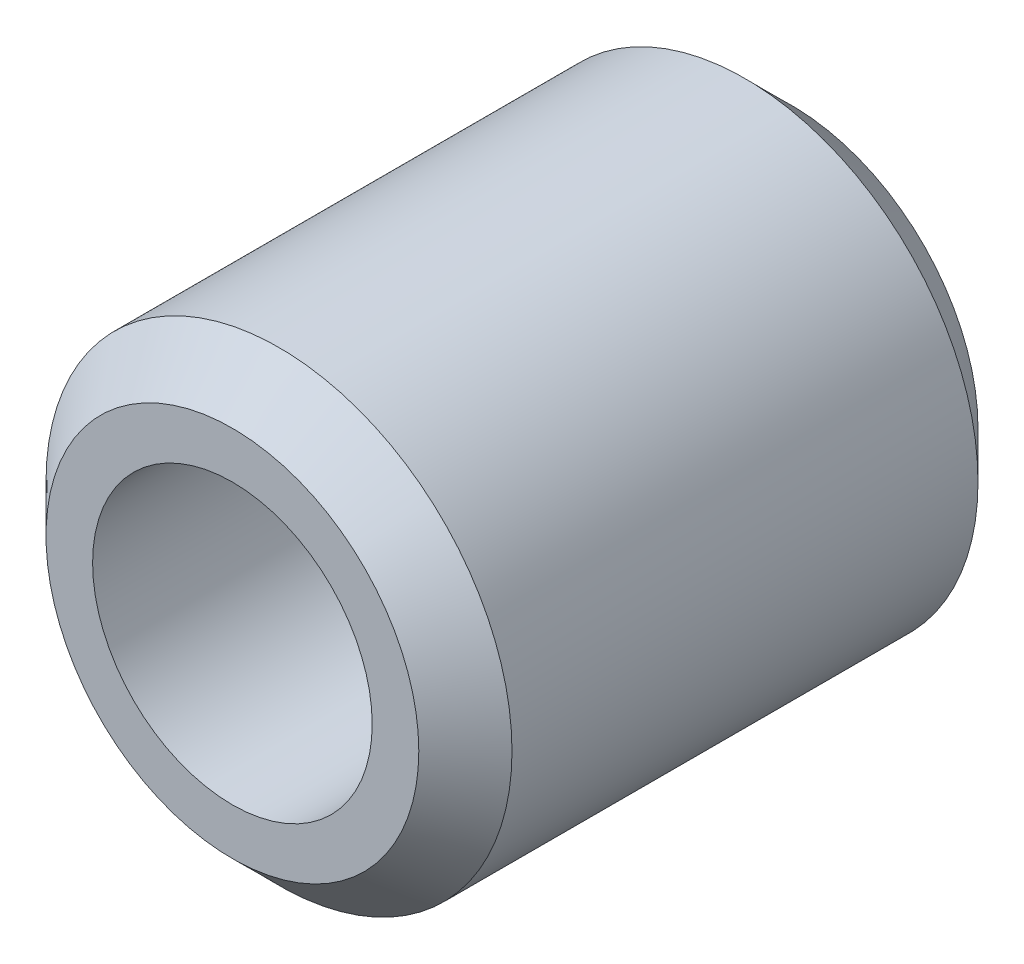
ISO-10303-21;
HEADER;
FILE_DESCRIPTION(('STEP AP214'),'2;1');
FILE_NAME('part.step','',(''),(''),'','','');
FILE_SCHEMA(('AUTOMOTIVE_DESIGN { 1 0 10303 214 1 1 1 1 }'));
ENDSEC;
DATA;
#1=APPLICATION_CONTEXT('core data for automotive mechanical design processes');
#2=APPLICATION_PROTOCOL_DEFINITION('international standard','automotive_design',2000,#1);
#3=PRODUCT_CONTEXT('',#1,'mechanical');
#4=PRODUCT('Part','Part','',(#3));
#5=PRODUCT_RELATED_PRODUCT_CATEGORY('part','',(#4));
#6=PRODUCT_DEFINITION_FORMATION('','',#4);
#7=PRODUCT_DEFINITION_CONTEXT('part definition',#1,'design');
#8=PRODUCT_DEFINITION('design','',#6,#7);
#9=PRODUCT_DEFINITION_SHAPE('','',#8);
#10=(LENGTH_UNIT() NAMED_UNIT(*) SI_UNIT(.MILLI.,.METRE.));
#11=(NAMED_UNIT(*) PLANE_ANGLE_UNIT() SI_UNIT($,.RADIAN.));
#12=(NAMED_UNIT(*) SI_UNIT($,.STERADIAN.) SOLID_ANGLE_UNIT());
#13=UNCERTAINTY_MEASURE_WITH_UNIT(LENGTH_MEASURE(1.E-05),#10,'distance_accuracy_value','');
#14=(GEOMETRIC_REPRESENTATION_CONTEXT(3) GLOBAL_UNCERTAINTY_ASSIGNED_CONTEXT((#13)) GLOBAL_UNIT_ASSIGNED_CONTEXT((#10,
#11,#12)) REPRESENTATION_CONTEXT('',''));
#15=CARTESIAN_POINT('',(0.,0.,0.));
#16=DIRECTION('',(0.,0.,1.));
#17=DIRECTION('',(1.,0.,0.));
#18=AXIS2_PLACEMENT_3D('',#15,#16,#17);
#19=CARTESIAN_POINT('',(0.,0.,-19.05));
#20=DIRECTION('',(0.,0.,1.));
#21=DIRECTION('',(1.,0.,0.));
#22=AXIS2_PLACEMENT_3D('',#19,#20,#21);
#23=PLANE('',#22);
#24=CARTESIAN_POINT('',(0.,0.,-19.05));
#25=DIRECTION('',(0.,0.,1.));
#26=DIRECTION('',(1.,0.,0.));
#27=AXIS2_PLACEMENT_3D('',#24,#25,#26);
#28=CIRCLE('',#27,6.34999999999998);
#29=CARTESIAN_POINT('',(6.34999999999998,0.,-19.05));
#30=VERTEX_POINT('',#29);
#31=EDGE_CURVE('E41',#30,#30,#28,.F.);
#32=ORIENTED_EDGE('',*,*,#31,.T.);
#33=EDGE_LOOP('',(#32));
#34=FACE_BOUND('',#33,.T.);
#35=ADVANCED_FACE('F34',(#34),#23,.F.);
#36=CARTESIAN_POINT('',(0.,0.,-19.05));
#37=DIRECTION('',(0.,0.,1.));
#38=DIRECTION('',(1.,0.,0.));
#39=AXIS2_PLACEMENT_3D('',#36,#37,#38);
#40=CYLINDRICAL_SURFACE('',#39,7.9375);
#41=CARTESIAN_POINT('',(0.,0.,-17.4625));
#42=DIRECTION('',(0.,0.,1.));
#43=DIRECTION('',(1.,0.,0.));
#44=AXIS2_PLACEMENT_3D('',#41,#42,#43);
#45=CIRCLE('',#44,7.9375);
#46=CARTESIAN_POINT('',(7.9375,0.,-17.4625));
#47=VERTEX_POINT('',#46);
#48=EDGE_CURVE('E45',#47,#47,#45,.T.);
#49=CARTESIAN_POINT('',(0.,0.,-1.58749999999999));
#50=DIRECTION('',(0.,0.,1.));
#51=DIRECTION('',(1.,0.,0.));
#52=AXIS2_PLACEMENT_3D('',#49,#50,#51);
#53=CIRCLE('',#52,7.9375);
#54=CARTESIAN_POINT('',(7.9375,0.,-1.58749999999999));
#55=VERTEX_POINT('',#54);
#56=EDGE_CURVE('E49',#55,#55,#53,.F.);
#57=CARTESIAN_POINT('',(7.9375,0.,-17.4625));
#58=CARTESIAN_POINT('',(7.9375,0.,-17.2971354166667));
#59=CARTESIAN_POINT('',(7.9375,0.,-17.1317708333333));
#60=CARTESIAN_POINT('',(7.9375,0.,-16.8010416666667));
#61=CARTESIAN_POINT('',(7.9375,0.,-16.6356770833333));
#62=CARTESIAN_POINT('',(7.9375,0.,-16.3049479166667));
#63=CARTESIAN_POINT('',(7.9375,0.,-16.1395833333333));
#64=CARTESIAN_POINT('',(7.9375,0.,-15.8088541666667));
#65=CARTESIAN_POINT('',(7.9375,0.,-15.6434895833333));
#66=CARTESIAN_POINT('',(7.9375,0.,-15.3127604166667));
#67=CARTESIAN_POINT('',(7.9375,0.,-15.1473958333333));
#68=CARTESIAN_POINT('',(7.9375,0.,-14.8166666666667));
#69=CARTESIAN_POINT('',(7.9375,0.,-14.6513020833333));
#70=CARTESIAN_POINT('',(7.9375,0.,-14.3205729166667));
#71=CARTESIAN_POINT('',(7.9375,0.,-14.1552083333333));
#72=CARTESIAN_POINT('',(7.9375,0.,-13.8244791666667));
#73=CARTESIAN_POINT('',(7.9375,0.,-13.6591145833333));
#74=CARTESIAN_POINT('',(7.9375,0.,-13.3283854166667));
#75=CARTESIAN_POINT('',(7.9375,0.,-13.1630208333333));
#76=CARTESIAN_POINT('',(7.9375,0.,-12.8322916666667));
#77=CARTESIAN_POINT('',(7.9375,0.,-12.6669270833333));
#78=CARTESIAN_POINT('',(7.9375,0.,-12.3361979166667));
#79=CARTESIAN_POINT('',(7.9375,0.,-12.1708333333333));
#80=CARTESIAN_POINT('',(7.9375,0.,-11.8401041666667));
#81=CARTESIAN_POINT('',(7.9375,0.,-11.6747395833333));
#82=CARTESIAN_POINT('',(7.9375,0.,-11.3440104166667));
#83=CARTESIAN_POINT('',(7.9375,0.,-11.1786458333333));
#84=CARTESIAN_POINT('',(7.9375,0.,-10.8479166666667));
#85=CARTESIAN_POINT('',(7.9375,0.,-10.6825520833333));
#86=CARTESIAN_POINT('',(7.9375,0.,-10.3518229166667));
#87=CARTESIAN_POINT('',(7.9375,0.,-10.1864583333333));
#88=CARTESIAN_POINT('',(7.9375,0.,-9.85572916666666));
#89=CARTESIAN_POINT('',(7.9375,0.,-9.69036458333332));
#90=CARTESIAN_POINT('',(7.9375,0.,-9.35963541666666));
#91=CARTESIAN_POINT('',(7.9375,0.,-9.19427083333333));
#92=CARTESIAN_POINT('',(7.9375,0.,-8.86354166666666));
#93=CARTESIAN_POINT('',(7.9375,0.,-8.69817708333333));
#94=CARTESIAN_POINT('',(7.9375,0.,-8.36744791666666));
#95=CARTESIAN_POINT('',(7.9375,0.,-8.20208333333333));
#96=CARTESIAN_POINT('',(7.9375,0.,-7.87135416666666));
#97=CARTESIAN_POINT('',(7.9375,0.,-7.70598958333333));
#98=CARTESIAN_POINT('',(7.9375,0.,-7.37526041666666));
#99=CARTESIAN_POINT('',(7.9375,0.,-7.20989583333333));
#100=CARTESIAN_POINT('',(7.9375,0.,-6.87916666666666));
#101=CARTESIAN_POINT('',(7.9375,0.,-6.71380208333333));
#102=CARTESIAN_POINT('',(7.9375,0.,-6.38307291666666));
#103=CARTESIAN_POINT('',(7.9375,0.,-6.21770833333332));
#104=CARTESIAN_POINT('',(7.9375,0.,-5.88697916666666));
#105=CARTESIAN_POINT('',(7.9375,0.,-5.72161458333333));
#106=CARTESIAN_POINT('',(7.9375,0.,-5.39088541666666));
#107=CARTESIAN_POINT('',(7.9375,0.,-5.22552083333333));
#108=CARTESIAN_POINT('',(7.9375,0.,-4.89479166666666));
#109=CARTESIAN_POINT('',(7.9375,0.,-4.72942708333333));
#110=CARTESIAN_POINT('',(7.9375,0.,-4.39869791666666));
#111=CARTESIAN_POINT('',(7.9375,0.,-4.23333333333332));
#112=CARTESIAN_POINT('',(7.9375,0.,-3.90260416666666));
#113=CARTESIAN_POINT('',(7.9375,0.,-3.73723958333332));
#114=CARTESIAN_POINT('',(7.9375,0.,-3.40651041666666));
#115=CARTESIAN_POINT('',(7.9375,0.,-3.24114583333333));
#116=CARTESIAN_POINT('',(7.9375,0.,-2.91041666666666));
#117=CARTESIAN_POINT('',(7.9375,0.,-2.74505208333333));
#118=CARTESIAN_POINT('',(7.9375,0.,-2.41432291666666));
#119=CARTESIAN_POINT('',(7.9375,0.,-2.24895833333332));
#120=CARTESIAN_POINT('',(7.9375,0.,-1.91822916666666));
#121=CARTESIAN_POINT('',(7.9375,0.,-1.75286458333332));
#122=CARTESIAN_POINT('',(7.9375,0.,-1.58749999999999));
#123=B_SPLINE_CURVE_WITH_KNOTS('',3,(#57,#58,#59,#60,#61,#62,#63,#64,#65,#66,#67,#68,#69,#70,
#71,#72,#73,#74,#75,#76,#77,#78,#79,#80,#81,#82,#83,#84,#85,#86,#87,#88,#89,#90,#91,#92,#93,#94,
#95,#96,#97,#98,#99,#100,#101,#102,#103,#104,#105,#106,#107,#108,#109,#110,#111,#112,#113,#114,
#115,#116,#117,#118,#119,#120,#121,#122),.UNSPECIFIED.,.F.,.F.,(4,2,2,2,2,2,2,2,2,2,2,2,2,2,2,2,
2,2,2,2,2,2,2,2,2,2,2,2,2,2,2,2,4),(0.,0.496093749999999,0.992187499999998,1.48828125,1.984375,
2.48046875,2.9765625,3.47265625,3.96875,4.46484375,4.9609375,5.45703125,5.953125,6.44921875,
6.9453125,7.44140625,7.9375,8.43359375,8.9296875,9.42578125,9.921875,10.41796875,10.9140625,
11.41015625,11.90625,12.40234375,12.8984375,13.39453125,13.890625,14.38671875,14.8828125,
15.37890625,15.875),.UNSPECIFIED.);
#124=EDGE_CURVE('BSEAM71',#47,#55,#123,.T.);
#125=ORIENTED_EDGE('',*,*,#48,.T.);
#126=ORIENTED_EDGE('',*,*,#56,.T.);
#127=ORIENTED_EDGE('',*,*,#124,.T.);
#128=ORIENTED_EDGE('',*,*,#124,.F.);
#129=EDGE_LOOP('',(#125,#127,#126,#128));
#130=FACE_BOUND('',#129,.T.);
#131=ADVANCED_FACE('F71',(#130),#40,.T.);
#132=CARTESIAN_POINT('',(0.,0.,0.));
#133=DIRECTION('',(0.,0.,1.));
#134=DIRECTION('',(1.,0.,0.));
#135=AXIS2_PLACEMENT_3D('',#132,#133,#134);
#136=PLANE('',#135);
#137=CARTESIAN_POINT('',(0.,0.,0.));
#138=DIRECTION('',(0.,0.,1.));
#139=DIRECTION('',(1.,0.,0.));
#140=AXIS2_PLACEMENT_3D('',#137,#138,#139);
#141=CIRCLE('',#140,6.35000000000001);
#142=CARTESIAN_POINT('',(6.35000000000001,0.,0.));
#143=VERTEX_POINT('',#142);
#144=EDGE_CURVE('E10',#143,#143,#141,.T.);
#145=ORIENTED_EDGE('',*,*,#144,.T.);
#146=EDGE_LOOP('',(#145));
#147=FACE_BOUND('',#146,.T.);
#148=CARTESIAN_POINT('',(0.,0.,0.));
#149=DIRECTION('',(0.,0.,1.));
#150=DIRECTION('',(1.,0.,0.));
#151=AXIS2_PLACEMENT_3D('',#148,#149,#150);
#152=CIRCLE('',#151,4.7625);
#153=CARTESIAN_POINT('',(4.7625,0.,0.));
#154=VERTEX_POINT('',#153);
#155=EDGE_CURVE('E55',#154,#154,#152,.T.);
#156=ORIENTED_EDGE('',*,*,#155,.F.);
#157=EDGE_LOOP('',(#156));
#158=FACE_BOUND('',#157,.T.);
#159=ADVANCED_FACE('F66',(#147,#158),#136,.T.);
#160=CARTESIAN_POINT('',(0.,0.,-12.7));
#161=DIRECTION('',(0.,0.,1.));
#162=DIRECTION('',(1.,0.,0.));
#163=AXIS2_PLACEMENT_3D('',#160,#161,#162);
#164=CYLINDRICAL_SURFACE('',#163,4.7625);
#165=CARTESIAN_POINT('',(0.,0.,-12.7));
#166=DIRECTION('',(0.,0.,1.));
#167=DIRECTION('',(1.,0.,0.));
#168=AXIS2_PLACEMENT_3D('',#165,#166,#167);
#169=CIRCLE('',#168,4.7625);
#170=CARTESIAN_POINT('',(4.7625,0.,-12.7));
#171=VERTEX_POINT('',#170);
#172=EDGE_CURVE('E54',#171,#171,#169,.T.);
#173=ORIENTED_EDGE('',*,*,#172,.F.);
#174=EDGE_LOOP('',(#173));
#175=FACE_BOUND('',#174,.T.);
#176=ORIENTED_EDGE('',*,*,#155,.T.);
#177=EDGE_LOOP('',(#176));
#178=FACE_BOUND('',#177,.T.);
#179=ADVANCED_FACE('F63',(#175,#178),#164,.F.);
#180=CARTESIAN_POINT('',(0.,0.,-12.7));
#181=DIRECTION('',(0.,0.,1.));
#182=DIRECTION('',(1.,0.,0.));
#183=AXIS2_PLACEMENT_3D('',#180,#181,#182);
#184=PLANE('',#183);
#185=ORIENTED_EDGE('',*,*,#172,.T.);
#186=EDGE_LOOP('',(#185));
#187=FACE_BOUND('',#186,.T.);
#188=ADVANCED_FACE('F61',(#187),#184,.T.);
#189=CARTESIAN_POINT('',(0.,0.,-17.4625));
#190=DIRECTION('',(0.,0.,1.));
#191=DIRECTION('',(1.,0.,0.));
#192=AXIS2_PLACEMENT_3D('',#189,#190,#191);
#193=CONICAL_SURFACE('',#192,7.9375,0.785398163397451);
#194=ORIENTED_EDGE('',*,*,#31,.F.);
#195=EDGE_LOOP('',(#194));
#196=FACE_BOUND('',#195,.T.);
#197=ORIENTED_EDGE('',*,*,#48,.F.);
#198=EDGE_LOOP('',(#197));
#199=FACE_BOUND('',#198,.T.);
#200=ADVANCED_FACE('F84',(#196,#199),#193,.T.);
#201=CARTESIAN_POINT('',(0.,0.,0.));
#202=DIRECTION('',(0.,0.,-1.));
#203=DIRECTION('',(-1.,0.,0.));
#204=AXIS2_PLACEMENT_3D('',#201,#202,#203);
#205=CONICAL_SURFACE('',#204,6.35000000000001,0.785398163397449);
#206=ORIENTED_EDGE('',*,*,#56,.F.);
#207=EDGE_LOOP('',(#206));
#208=FACE_BOUND('',#207,.T.);
#209=ORIENTED_EDGE('',*,*,#144,.F.);
#210=EDGE_LOOP('',(#209));
#211=FACE_BOUND('',#210,.T.);
#212=ADVANCED_FACE('F36',(#208,#211),#205,.T.);
#213=CLOSED_SHELL('',(#35,#131,#159,#179,#188,#200,#212));
#214=MANIFOLD_SOLID_BREP('B2',#213);
#215=ADVANCED_BREP_SHAPE_REPRESENTATION('',(#18,#214),#14);
#216=SHAPE_DEFINITION_REPRESENTATION(#9,#215);
ENDSEC;
END-ISO-10303-21;
